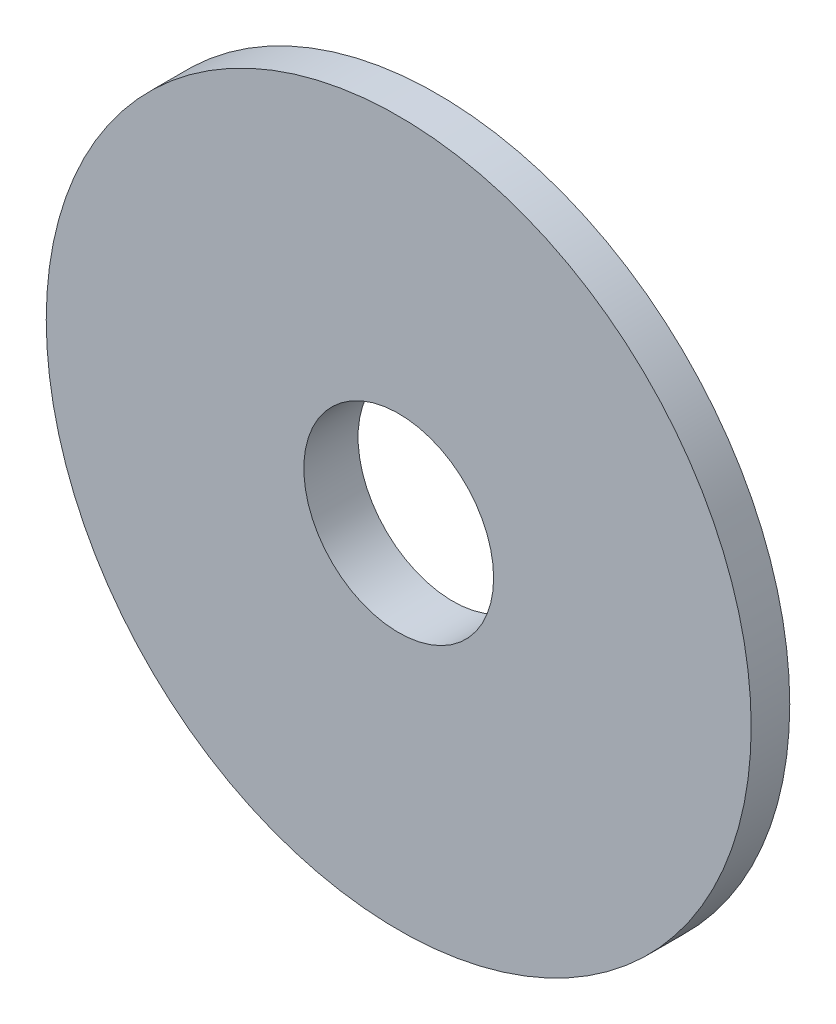
ISO-10303-21;
HEADER;
FILE_DESCRIPTION(('STEP AP214'),'2;1');
FILE_NAME('part.step','',(''),(''),'','','');
FILE_SCHEMA(('AUTOMOTIVE_DESIGN { 1 0 10303 214 1 1 1 1 }'));
ENDSEC;
DATA;
#1=APPLICATION_CONTEXT('core data for automotive mechanical design processes');
#2=APPLICATION_PROTOCOL_DEFINITION('international standard','automotive_design',2000,#1);
#3=PRODUCT_CONTEXT('',#1,'mechanical');
#4=PRODUCT('Part','Part','',(#3));
#5=PRODUCT_RELATED_PRODUCT_CATEGORY('part','',(#4));
#6=PRODUCT_DEFINITION_FORMATION('','',#4);
#7=PRODUCT_DEFINITION_CONTEXT('part definition',#1,'design');
#8=PRODUCT_DEFINITION('design','',#6,#7);
#9=PRODUCT_DEFINITION_SHAPE('','',#8);
#10=(LENGTH_UNIT() NAMED_UNIT(*) SI_UNIT(.MILLI.,.METRE.));
#11=(NAMED_UNIT(*) PLANE_ANGLE_UNIT() SI_UNIT($,.RADIAN.));
#12=(NAMED_UNIT(*) SI_UNIT($,.STERADIAN.) SOLID_ANGLE_UNIT());
#13=UNCERTAINTY_MEASURE_WITH_UNIT(LENGTH_MEASURE(1.E-05),#10,'distance_accuracy_value','');
#14=(GEOMETRIC_REPRESENTATION_CONTEXT(3) GLOBAL_UNCERTAINTY_ASSIGNED_CONTEXT((#13)) GLOBAL_UNIT_ASSIGNED_CONTEXT((#10,
#11,#12)) REPRESENTATION_CONTEXT('',''));
#15=CARTESIAN_POINT('',(0.,0.,0.));
#16=DIRECTION('',(0.,0.,1.));
#17=DIRECTION('',(1.,0.,0.));
#18=AXIS2_PLACEMENT_3D('',#15,#16,#17);
#19=CARTESIAN_POINT('',(0.,0.,2.));
#20=DIRECTION('',(0.,0.,1.));
#21=DIRECTION('',(1.,0.,0.));
#22=AXIS2_PLACEMENT_3D('',#19,#20,#21);
#23=PLANE('',#22);
#24=CARTESIAN_POINT('',(0.,0.,2.));
#25=DIRECTION('',(0.,0.,1.));
#26=DIRECTION('',(1.,0.,0.));
#27=AXIS2_PLACEMENT_3D('',#24,#25,#26);
#28=CIRCLE('',#27,13.);
#29=CARTESIAN_POINT('',(13.,0.,2.));
#30=VERTEX_POINT('',#29);
#31=EDGE_CURVE('E41',#30,#30,#28,.T.);
#32=ORIENTED_EDGE('',*,*,#31,.T.);
#33=EDGE_LOOP('',(#32));
#34=FACE_BOUND('',#33,.T.);
#35=CARTESIAN_POINT('',(0.,0.,2.));
#36=DIRECTION('',(0.,0.,1.));
#37=DIRECTION('',(1.,0.,0.));
#38=AXIS2_PLACEMENT_3D('',#35,#36,#37);
#39=CIRCLE('',#38,3.5);
#40=CARTESIAN_POINT('',(3.5,0.,2.));
#41=VERTEX_POINT('',#40);
#42=EDGE_CURVE('E45',#41,#41,#39,.T.);
#43=ORIENTED_EDGE('',*,*,#42,.F.);
#44=EDGE_LOOP('',(#43));
#45=FACE_BOUND('',#44,.T.);
#46=ADVANCED_FACE('F30',(#34,#45),#23,.T.);
#47=CARTESIAN_POINT('',(0.,0.,0.));
#48=DIRECTION('',(0.,0.,1.));
#49=DIRECTION('',(1.,0.,0.));
#50=AXIS2_PLACEMENT_3D('',#47,#48,#49);
#51=PLANE('',#50);
#52=CARTESIAN_POINT('',(0.,0.,0.));
#53=DIRECTION('',(0.,0.,1.));
#54=DIRECTION('',(1.,0.,0.));
#55=AXIS2_PLACEMENT_3D('',#52,#53,#54);
#56=CIRCLE('',#55,12.);
#57=CARTESIAN_POINT('',(12.,0.,0.));
#58=VERTEX_POINT('',#57);
#59=EDGE_CURVE('E10',#58,#58,#56,.F.);
#60=ORIENTED_EDGE('',*,*,#59,.T.);
#61=EDGE_LOOP('',(#60));
#62=FACE_BOUND('',#61,.T.);
#63=CARTESIAN_POINT('',(0.,0.,0.));
#64=DIRECTION('',(0.,0.,1.));
#65=DIRECTION('',(1.,0.,0.));
#66=AXIS2_PLACEMENT_3D('',#63,#64,#65);
#67=CIRCLE('',#66,3.5);
#68=CARTESIAN_POINT('',(3.5,0.,0.));
#69=VERTEX_POINT('',#68);
#70=EDGE_CURVE('E48',#69,#69,#67,.T.);
#71=ORIENTED_EDGE('',*,*,#70,.T.);
#72=EDGE_LOOP('',(#71));
#73=FACE_BOUND('',#72,.T.);
#74=ADVANCED_FACE('F58',(#62,#73),#51,.F.);
#75=CARTESIAN_POINT('',(0.,0.,2.));
#76=DIRECTION('',(0.,0.,-1.));
#77=DIRECTION('',(-1.,0.,0.));
#78=AXIS2_PLACEMENT_3D('',#75,#76,#77);
#79=CYLINDRICAL_SURFACE('',#78,13.);
#80=CARTESIAN_POINT('',(0.,0.,0.577350269189625));
#81=DIRECTION('',(0.,0.,1.));
#82=DIRECTION('',(1.,0.,0.));
#83=AXIS2_PLACEMENT_3D('',#80,#81,#82);
#84=CIRCLE('',#83,13.);
#85=CARTESIAN_POINT('',(13.,0.,0.577350269189625));
#86=VERTEX_POINT('',#85);
#87=EDGE_CURVE('E37',#86,#86,#84,.T.);
#88=ORIENTED_EDGE('',*,*,#87,.T.);
#89=EDGE_LOOP('',(#88));
#90=FACE_BOUND('',#89,.T.);
#91=ORIENTED_EDGE('',*,*,#31,.F.);
#92=EDGE_LOOP('',(#91));
#93=FACE_BOUND('',#92,.T.);
#94=ADVANCED_FACE('F64',(#90,#93),#79,.T.);
#95=CARTESIAN_POINT('',(0.,0.,2.));
#96=DIRECTION('',(0.,0.,-1.));
#97=DIRECTION('',(-1.,0.,0.));
#98=AXIS2_PLACEMENT_3D('',#95,#96,#97);
#99=CYLINDRICAL_SURFACE('',#98,3.5);
#100=ORIENTED_EDGE('',*,*,#42,.T.);
#101=EDGE_LOOP('',(#100));
#102=FACE_BOUND('',#101,.T.);
#103=ORIENTED_EDGE('',*,*,#70,.F.);
#104=EDGE_LOOP('',(#103));
#105=FACE_BOUND('',#104,.T.);
#106=ADVANCED_FACE('F54',(#102,#105),#99,.F.);
#107=CARTESIAN_POINT('',(0.,0.,0.577350269189625));
#108=DIRECTION('',(0.,0.,1.));
#109=DIRECTION('',(1.,0.,0.));
#110=AXIS2_PLACEMENT_3D('',#107,#108,#109);
#111=CONICAL_SURFACE('',#110,13.,1.0471975511966);
#112=ORIENTED_EDGE('',*,*,#59,.F.);
#113=EDGE_LOOP('',(#112));
#114=FACE_BOUND('',#113,.T.);
#115=ORIENTED_EDGE('',*,*,#87,.F.);
#116=EDGE_LOOP('',(#115));
#117=FACE_BOUND('',#116,.T.);
#118=ADVANCED_FACE('F32',(#114,#117),#111,.T.);
#119=CLOSED_SHELL('',(#46,#74,#94,#106,#118));
#120=MANIFOLD_SOLID_BREP('B2',#119);
#121=ADVANCED_BREP_SHAPE_REPRESENTATION('',(#18,#120),#14);
#122=SHAPE_DEFINITION_REPRESENTATION(#9,#121);
ENDSEC;
END-ISO-10303-21;
